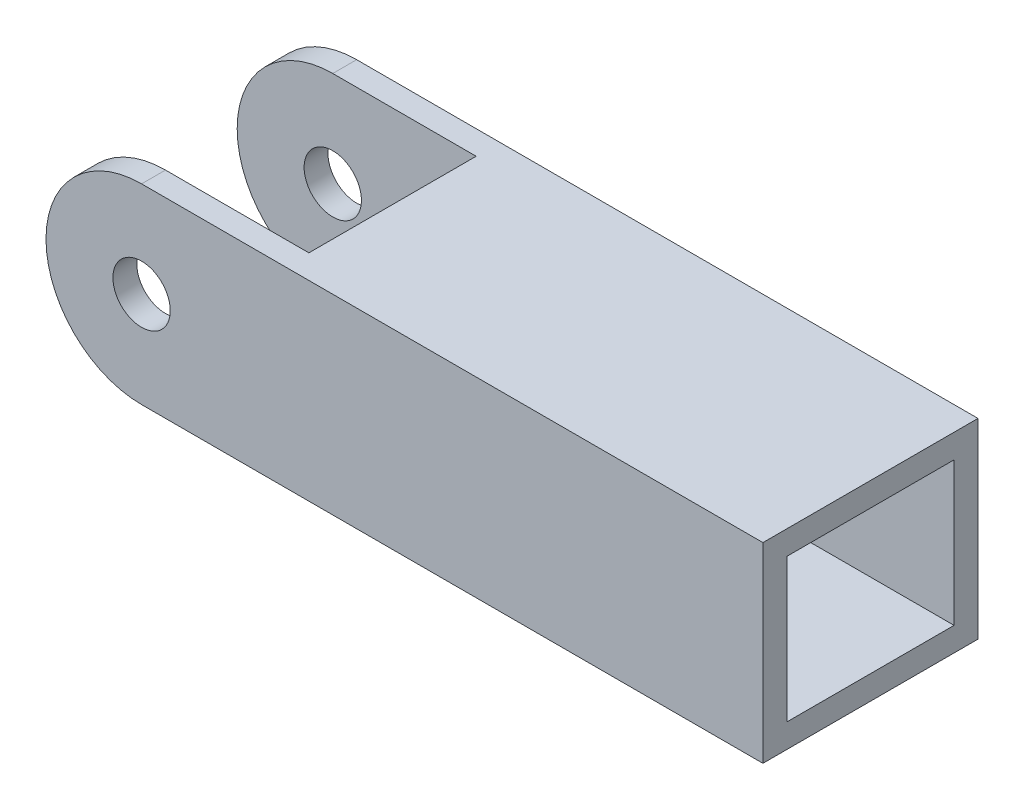
ISO-10303-21;
HEADER;
FILE_DESCRIPTION(('STEP AP214'),'2;1');
FILE_NAME('part.step','',(''),(''),'','','');
FILE_SCHEMA(('AUTOMOTIVE_DESIGN { 1 0 10303 214 1 1 1 1 }'));
ENDSEC;
DATA;
#1=APPLICATION_CONTEXT('core data for automotive mechanical design processes');
#2=APPLICATION_PROTOCOL_DEFINITION('international standard','automotive_design',2000,#1);
#3=PRODUCT_CONTEXT('',#1,'mechanical');
#4=PRODUCT('Part','Part','',(#3));
#5=PRODUCT_RELATED_PRODUCT_CATEGORY('part','',(#4));
#6=PRODUCT_DEFINITION_FORMATION('','',#4);
#7=PRODUCT_DEFINITION_CONTEXT('part definition',#1,'design');
#8=PRODUCT_DEFINITION('design','',#6,#7);
#9=PRODUCT_DEFINITION_SHAPE('','',#8);
#10=(LENGTH_UNIT() NAMED_UNIT(*) SI_UNIT(.MILLI.,.METRE.));
#11=(NAMED_UNIT(*) PLANE_ANGLE_UNIT() SI_UNIT($,.RADIAN.));
#12=(NAMED_UNIT(*) SI_UNIT($,.STERADIAN.) SOLID_ANGLE_UNIT());
#13=UNCERTAINTY_MEASURE_WITH_UNIT(LENGTH_MEASURE(1.E-05),#10,'distance_accuracy_value','');
#14=(GEOMETRIC_REPRESENTATION_CONTEXT(3) GLOBAL_UNCERTAINTY_ASSIGNED_CONTEXT((#13)) GLOBAL_UNIT_ASSIGNED_CONTEXT((#10,
#11,#12)) REPRESENTATION_CONTEXT('',''));
#15=CARTESIAN_POINT('',(0.,0.,0.));
#16=DIRECTION('',(0.,0.,1.));
#17=DIRECTION('',(1.,0.,0.));
#18=AXIS2_PLACEMENT_3D('',#15,#16,#17);
#19=CARTESIAN_POINT('',(-65.,0.,5.));
#20=DIRECTION('',(0.,0.,-1.));
#21=DIRECTION('',(-1.,0.,0.));
#22=AXIS2_PLACEMENT_3D('',#19,#20,#21);
#23=CYLINDRICAL_SURFACE('',#22,20.);
#24=CARTESIAN_POINT('',(-65.,0.,0.));
#25=DIRECTION('',(0.,0.,-1.));
#26=DIRECTION('',(-1.,0.,0.));
#27=AXIS2_PLACEMENT_3D('',#24,#25,#26);
#28=CIRCLE('',#27,20.);
#29=CARTESIAN_POINT('',(-65.,-20.,0.));
#30=VERTEX_POINT('',#29);
#31=CARTESIAN_POINT('',(-65.,20.,0.));
#32=VERTEX_POINT('',#31);
#33=EDGE_CURVE('E205',#30,#32,#28,.T.);
#34=ORIENTED_EDGE('',*,*,#33,.F.);
#35=DIRECTION('',(0.,0.,-1.));
#36=VECTOR('',#35,1.);
#37=CARTESIAN_POINT('',(-65.,-20.,5.));
#38=LINE('',#37,#36);
#39=CARTESIAN_POINT('',(-65.,-20.,5.));
#40=VERTEX_POINT('',#39);
#41=EDGE_CURVE('E11',#40,#30,#38,.T.);
#42=ORIENTED_EDGE('',*,*,#41,.F.);
#43=CARTESIAN_POINT('',(-65.,0.,5.));
#44=DIRECTION('',(0.,0.,-1.));
#45=DIRECTION('',(-1.,0.,0.));
#46=AXIS2_PLACEMENT_3D('',#43,#44,#45);
#47=CIRCLE('',#46,20.);
#48=CARTESIAN_POINT('',(-65.,20.,5.));
#49=VERTEX_POINT('',#48);
#50=EDGE_CURVE('E208',#40,#49,#47,.T.);
#51=ORIENTED_EDGE('',*,*,#50,.T.);
#52=DIRECTION('',(0.,0.,-1.));
#53=VECTOR('',#52,1.);
#54=CARTESIAN_POINT('',(-65.,20.,5.));
#55=LINE('',#54,#53);
#56=EDGE_CURVE('E37',#49,#32,#55,.T.);
#57=ORIENTED_EDGE('',*,*,#56,.T.);
#58=EDGE_LOOP('',(#34,#42,#51,#57));
#59=FACE_BOUND('',#58,.T.);
#60=ADVANCED_FACE('F34',(#59),#23,.T.);
#61=CARTESIAN_POINT('',(-65.,-20.,5.));
#62=DIRECTION('',(0.,1.,0.));
#63=DIRECTION('',(0.,0.,1.));
#64=AXIS2_PLACEMENT_3D('',#61,#62,#63);
#65=PLANE('',#64);
#66=DIRECTION('',(1.,0.,0.));
#67=VECTOR('',#66,1.);
#68=CARTESIAN_POINT('',(-65.,-20.,0.));
#69=LINE('',#68,#67);
#70=CARTESIAN_POINT('',(65.,-20.,0.));
#71=VERTEX_POINT('',#70);
#72=EDGE_CURVE('E212',#30,#71,#69,.T.);
#73=ORIENTED_EDGE('',*,*,#72,.T.);
#74=DIRECTION('',(0.,0.,-1.));
#75=VECTOR('',#74,1.);
#76=CARTESIAN_POINT('',(65.,-20.,5.));
#77=LINE('',#76,#75);
#78=CARTESIAN_POINT('',(65.,-20.,45.));
#79=VERTEX_POINT('',#78);
#80=EDGE_CURVE('E42',#79,#71,#77,.T.);
#81=ORIENTED_EDGE('',*,*,#80,.F.);
#82=DIRECTION('',(1.,0.,0.));
#83=VECTOR('',#82,1.);
#84=CARTESIAN_POINT('',(-65.,-20.,45.));
#85=LINE('',#84,#83);
#86=CARTESIAN_POINT('',(-65.,-20.,45.));
#87=VERTEX_POINT('',#86);
#88=EDGE_CURVE('E167',#87,#79,#85,.T.);
#89=ORIENTED_EDGE('',*,*,#88,.F.);
#90=DIRECTION('',(0.,0.,1.));
#91=VECTOR('',#90,1.);
#92=CARTESIAN_POINT('',(-65.,-20.,40.));
#93=LINE('',#92,#91);
#94=CARTESIAN_POINT('',(-65.,-20.,40.));
#95=VERTEX_POINT('',#94);
#96=EDGE_CURVE('E184',#95,#87,#93,.T.);
#97=ORIENTED_EDGE('',*,*,#96,.F.);
#98=DIRECTION('',(1.,0.,0.));
#99=VECTOR('',#98,1.);
#100=CARTESIAN_POINT('',(-65.,-20.,40.));
#101=LINE('',#100,#99);
#102=CARTESIAN_POINT('',(-35.,-20.,40.));
#103=VERTEX_POINT('',#102);
#104=EDGE_CURVE('E171',#95,#103,#101,.T.);
#105=ORIENTED_EDGE('',*,*,#104,.T.);
#106=DIRECTION('',(0.,0.,-1.));
#107=VECTOR('',#106,1.);
#108=CARTESIAN_POINT('',(-35.,-20.,40.));
#109=LINE('',#108,#107);
#110=CARTESIAN_POINT('',(-35.,-20.,5.));
#111=VERTEX_POINT('',#110);
#112=EDGE_CURVE('E127',#103,#111,#109,.T.);
#113=ORIENTED_EDGE('',*,*,#112,.T.);
#114=DIRECTION('',(1.,0.,0.));
#115=VECTOR('',#114,1.);
#116=CARTESIAN_POINT('',(-65.,-20.,5.));
#117=LINE('',#116,#115);
#118=EDGE_CURVE('E55',#40,#111,#117,.T.);
#119=ORIENTED_EDGE('',*,*,#118,.F.);
#120=ORIENTED_EDGE('',*,*,#41,.T.);
#121=EDGE_LOOP('',(#73,#81,#89,#97,#105,#113,#119,#120));
#122=FACE_BOUND('',#121,.T.);
#123=ADVANCED_FACE('F241',(#122),#65,.F.);
#124=CARTESIAN_POINT('',(65.,-20.,5.));
#125=DIRECTION('',(-1.,0.,0.));
#126=DIRECTION('',(0.,0.,1.));
#127=AXIS2_PLACEMENT_3D('',#124,#125,#126);
#128=PLANE('',#127);
#129=DIRECTION('',(0.,1.,0.));
#130=VECTOR('',#129,1.);
#131=CARTESIAN_POINT('',(65.,-20.,0.));
#132=LINE('',#131,#130);
#133=CARTESIAN_POINT('',(65.,20.,0.));
#134=VERTEX_POINT('',#133);
#135=EDGE_CURVE('E223',#71,#134,#132,.T.);
#136=ORIENTED_EDGE('',*,*,#135,.T.);
#137=DIRECTION('',(0.,0.,-1.));
#138=VECTOR('',#137,1.);
#139=CARTESIAN_POINT('',(65.,20.,5.));
#140=LINE('',#139,#138);
#141=CARTESIAN_POINT('',(65.,20.,45.));
#142=VERTEX_POINT('',#141);
#143=EDGE_CURVE('E227',#142,#134,#140,.T.);
#144=ORIENTED_EDGE('',*,*,#143,.F.);
#145=DIRECTION('',(0.,1.,0.));
#146=VECTOR('',#145,1.);
#147=CARTESIAN_POINT('',(65.,-20.,45.));
#148=LINE('',#147,#146);
#149=EDGE_CURVE('E179',#79,#142,#148,.T.);
#150=ORIENTED_EDGE('',*,*,#149,.F.);
#151=ORIENTED_EDGE('',*,*,#80,.T.);
#152=EDGE_LOOP('',(#136,#144,#150,#151));
#153=FACE_BOUND('',#152,.T.);
#154=DIRECTION('',(0.,1.,0.));
#155=VECTOR('',#154,1.);
#156=CARTESIAN_POINT('',(65.,-20.,5.));
#157=LINE('',#156,#155);
#158=CARTESIAN_POINT('',(65.,-15.,5.));
#159=VERTEX_POINT('',#158);
#160=CARTESIAN_POINT('',(65.,15.,5.));
#161=VERTEX_POINT('',#160);
#162=EDGE_CURVE('E215',#159,#161,#157,.T.);
#163=ORIENTED_EDGE('',*,*,#162,.F.);
#164=DIRECTION('',(0.,0.,-1.));
#165=VECTOR('',#164,1.);
#166=CARTESIAN_POINT('',(65.,-15.,40.));
#167=LINE('',#166,#165);
#168=CARTESIAN_POINT('',(65.,-15.,40.));
#169=VERTEX_POINT('',#168);
#170=EDGE_CURVE('E139',#169,#159,#167,.T.);
#171=ORIENTED_EDGE('',*,*,#170,.F.);
#172=DIRECTION('',(0.,1.,0.));
#173=VECTOR('',#172,1.);
#174=CARTESIAN_POINT('',(65.,-20.,40.));
#175=LINE('',#174,#173);
#176=CARTESIAN_POINT('',(65.,15.,40.));
#177=VERTEX_POINT('',#176);
#178=EDGE_CURVE('E143',#169,#177,#175,.T.);
#179=ORIENTED_EDGE('',*,*,#178,.T.);
#180=DIRECTION('',(0.,0.,-1.));
#181=VECTOR('',#180,1.);
#182=CARTESIAN_POINT('',(65.,15.,40.));
#183=LINE('',#182,#181);
#184=EDGE_CURVE('E190',#177,#161,#183,.T.);
#185=ORIENTED_EDGE('',*,*,#184,.T.);
#186=EDGE_LOOP('',(#163,#171,#179,#185));
#187=FACE_BOUND('',#186,.T.);
#188=ADVANCED_FACE('F244',(#153,#187),#128,.F.);
#189=CARTESIAN_POINT('',(-65.,20.,5.));
#190=DIRECTION('',(0.,1.,0.));
#191=DIRECTION('',(0.,0.,1.));
#192=AXIS2_PLACEMENT_3D('',#189,#190,#191);
#193=PLANE('',#192);
#194=DIRECTION('',(1.,0.,0.));
#195=VECTOR('',#194,1.);
#196=CARTESIAN_POINT('',(-65.,20.,0.));
#197=LINE('',#196,#195);
#198=EDGE_CURVE('E220',#32,#134,#197,.T.);
#199=ORIENTED_EDGE('',*,*,#198,.F.);
#200=ORIENTED_EDGE('',*,*,#56,.F.);
#201=DIRECTION('',(1.,0.,0.));
#202=VECTOR('',#201,1.);
#203=CARTESIAN_POINT('',(-65.,20.,5.));
#204=LINE('',#203,#202);
#205=CARTESIAN_POINT('',(-35.,20.,5.));
#206=VERTEX_POINT('',#205);
#207=EDGE_CURVE('E211',#49,#206,#204,.T.);
#208=ORIENTED_EDGE('',*,*,#207,.T.);
#209=DIRECTION('',(0.,0.,1.));
#210=VECTOR('',#209,1.);
#211=CARTESIAN_POINT('',(-35.,20.,40.));
#212=LINE('',#211,#210);
#213=CARTESIAN_POINT('',(-35.,20.,40.));
#214=VERTEX_POINT('',#213);
#215=EDGE_CURVE('E187',#206,#214,#212,.T.);
#216=ORIENTED_EDGE('',*,*,#215,.T.);
#217=DIRECTION('',(1.,0.,0.));
#218=VECTOR('',#217,1.);
#219=CARTESIAN_POINT('',(-65.,20.,40.));
#220=LINE('',#219,#218);
#221=CARTESIAN_POINT('',(-65.,20.,40.));
#222=VERTEX_POINT('',#221);
#223=EDGE_CURVE('E166',#222,#214,#220,.T.);
#224=ORIENTED_EDGE('',*,*,#223,.F.);
#225=DIRECTION('',(0.,0.,1.));
#226=VECTOR('',#225,1.);
#227=CARTESIAN_POINT('',(-65.,20.,40.));
#228=LINE('',#227,#226);
#229=CARTESIAN_POINT('',(-65.,20.,45.));
#230=VERTEX_POINT('',#229);
#231=EDGE_CURVE('E173',#222,#230,#228,.T.);
#232=ORIENTED_EDGE('',*,*,#231,.T.);
#233=DIRECTION('',(1.,0.,0.));
#234=VECTOR('',#233,1.);
#235=CARTESIAN_POINT('',(-65.,20.,45.));
#236=LINE('',#235,#234);
#237=EDGE_CURVE('E176',#230,#142,#236,.T.);
#238=ORIENTED_EDGE('',*,*,#237,.T.);
#239=ORIENTED_EDGE('',*,*,#143,.T.);
#240=EDGE_LOOP('',(#199,#200,#208,#216,#224,#232,#238,#239));
#241=FACE_BOUND('',#240,.T.);
#242=ADVANCED_FACE('F234',(#241),#193,.T.);
#243=CARTESIAN_POINT('',(-65.,0.,5.));
#244=DIRECTION('',(0.,0.,-1.));
#245=DIRECTION('',(-1.,0.,0.));
#246=AXIS2_PLACEMENT_3D('',#243,#244,#245);
#247=PLANE('',#246);
#248=CARTESIAN_POINT('',(-65.,0.,5.));
#249=DIRECTION('',(0.,0.,-1.));
#250=DIRECTION('',(-1.,0.,0.));
#251=AXIS2_PLACEMENT_3D('',#248,#249,#250);
#252=CIRCLE('',#251,5.99999999999999);
#253=CARTESIAN_POINT('',(-71.,0.,5.));
#254=VERTEX_POINT('',#253);
#255=EDGE_CURVE('E159',#254,#254,#252,.T.);
#256=ORIENTED_EDGE('',*,*,#255,.T.);
#257=EDGE_LOOP('',(#256));
#258=FACE_BOUND('',#257,.T.);
#259=ORIENTED_EDGE('',*,*,#118,.T.);
#260=DIRECTION('',(0.,1.,0.));
#261=VECTOR('',#260,1.);
#262=CARTESIAN_POINT('',(-35.,0.,5.));
#263=LINE('',#262,#261);
#264=CARTESIAN_POINT('',(-35.,-15.,5.));
#265=VERTEX_POINT('',#264);
#266=EDGE_CURVE('E50',#111,#265,#263,.T.);
#267=ORIENTED_EDGE('',*,*,#266,.T.);
#268=DIRECTION('',(1.,0.,0.));
#269=VECTOR('',#268,1.);
#270=CARTESIAN_POINT('',(-65.,-15.,5.));
#271=LINE('',#270,#269);
#272=EDGE_CURVE('E131',#265,#159,#271,.T.);
#273=ORIENTED_EDGE('',*,*,#272,.T.);
#274=ORIENTED_EDGE('',*,*,#162,.T.);
#275=DIRECTION('',(-1.,0.,0.));
#276=VECTOR('',#275,1.);
#277=CARTESIAN_POINT('',(65.,15.,5.));
#278=LINE('',#277,#276);
#279=CARTESIAN_POINT('',(-35.,15.,5.));
#280=VERTEX_POINT('',#279);
#281=EDGE_CURVE('E193',#161,#280,#278,.T.);
#282=ORIENTED_EDGE('',*,*,#281,.T.);
#283=DIRECTION('',(0.,1.,0.));
#284=VECTOR('',#283,1.);
#285=CARTESIAN_POINT('',(-35.,15.,5.));
#286=LINE('',#285,#284);
#287=EDGE_CURVE('E200',#280,#206,#286,.T.);
#288=ORIENTED_EDGE('',*,*,#287,.T.);
#289=ORIENTED_EDGE('',*,*,#207,.F.);
#290=ORIENTED_EDGE('',*,*,#50,.F.);
#291=EDGE_LOOP('',(#259,#267,#273,#274,#282,#288,#289,#290));
#292=FACE_BOUND('',#291,.T.);
#293=ADVANCED_FACE('F255',(#258,#292),#247,.F.);
#294=CARTESIAN_POINT('',(-65.,0.,0.));
#295=DIRECTION('',(0.,0.,-1.));
#296=DIRECTION('',(-1.,0.,0.));
#297=AXIS2_PLACEMENT_3D('',#294,#295,#296);
#298=PLANE('',#297);
#299=ORIENTED_EDGE('',*,*,#135,.F.);
#300=ORIENTED_EDGE('',*,*,#72,.F.);
#301=ORIENTED_EDGE('',*,*,#33,.T.);
#302=ORIENTED_EDGE('',*,*,#198,.T.);
#303=EDGE_LOOP('',(#299,#300,#301,#302));
#304=FACE_BOUND('',#303,.T.);
#305=CARTESIAN_POINT('',(-65.,0.,0.));
#306=DIRECTION('',(0.,0.,-1.));
#307=DIRECTION('',(-1.,0.,0.));
#308=AXIS2_PLACEMENT_3D('',#305,#306,#307);
#309=CIRCLE('',#308,5.99999999999999);
#310=CARTESIAN_POINT('',(-71.,0.,0.));
#311=VERTEX_POINT('',#310);
#312=EDGE_CURVE('E150',#311,#311,#309,.T.);
#313=ORIENTED_EDGE('',*,*,#312,.F.);
#314=EDGE_LOOP('',(#313));
#315=FACE_BOUND('',#314,.T.);
#316=ADVANCED_FACE('F238',(#304,#315),#298,.T.);
#317=CARTESIAN_POINT('',(-35.,15.,40.));
#318=DIRECTION('',(-1.,0.,0.));
#319=DIRECTION('',(0.,0.,1.));
#320=AXIS2_PLACEMENT_3D('',#317,#318,#319);
#321=PLANE('',#320);
#322=ORIENTED_EDGE('',*,*,#215,.F.);
#323=ORIENTED_EDGE('',*,*,#287,.F.);
#324=DIRECTION('',(0.,0.,1.));
#325=VECTOR('',#324,1.);
#326=CARTESIAN_POINT('',(-35.,15.,40.));
#327=LINE('',#326,#325);
#328=CARTESIAN_POINT('',(-35.,15.,40.));
#329=VERTEX_POINT('',#328);
#330=EDGE_CURVE('E196',#280,#329,#327,.T.);
#331=ORIENTED_EDGE('',*,*,#330,.T.);
#332=DIRECTION('',(0.,1.,0.));
#333=VECTOR('',#332,1.);
#334=CARTESIAN_POINT('',(-35.,15.,40.));
#335=LINE('',#334,#333);
#336=EDGE_CURVE('E203',#329,#214,#335,.T.);
#337=ORIENTED_EDGE('',*,*,#336,.T.);
#338=EDGE_LOOP('',(#322,#323,#331,#337));
#339=FACE_BOUND('',#338,.T.);
#340=ADVANCED_FACE('F257',(#339),#321,.T.);
#341=CARTESIAN_POINT('',(0.,15.,0.));
#342=DIRECTION('',(0.,1.,0.));
#343=DIRECTION('',(0.,0.,1.));
#344=AXIS2_PLACEMENT_3D('',#341,#342,#343);
#345=PLANE('',#344);
#346=ORIENTED_EDGE('',*,*,#184,.F.);
#347=DIRECTION('',(1.,0.,0.));
#348=VECTOR('',#347,1.);
#349=CARTESIAN_POINT('',(65.,15.,40.));
#350=LINE('',#349,#348);
#351=EDGE_CURVE('E198',#329,#177,#350,.T.);
#352=ORIENTED_EDGE('',*,*,#351,.F.);
#353=ORIENTED_EDGE('',*,*,#330,.F.);
#354=ORIENTED_EDGE('',*,*,#281,.F.);
#355=EDGE_LOOP('',(#346,#352,#353,#354));
#356=FACE_BOUND('',#355,.T.);
#357=ADVANCED_FACE('F262',(#356),#345,.F.);
#358=CARTESIAN_POINT('',(-65.,0.,40.));
#359=DIRECTION('',(0.,0.,1.));
#360=DIRECTION('',(-1.,0.,0.));
#361=AXIS2_PLACEMENT_3D('',#358,#359,#360);
#362=CYLINDRICAL_SURFACE('',#361,20.);
#363=CARTESIAN_POINT('',(-65.,0.,45.));
#364=DIRECTION('',(0.,0.,-1.));
#365=DIRECTION('',(-1.,0.,0.));
#366=AXIS2_PLACEMENT_3D('',#363,#364,#365);
#367=CIRCLE('',#366,20.);
#368=EDGE_CURVE('E162',#87,#230,#367,.T.);
#369=ORIENTED_EDGE('',*,*,#368,.T.);
#370=ORIENTED_EDGE('',*,*,#231,.F.);
#371=CARTESIAN_POINT('',(-65.,0.,40.));
#372=DIRECTION('',(0.,0.,-1.));
#373=DIRECTION('',(-1.,0.,0.));
#374=AXIS2_PLACEMENT_3D('',#371,#372,#373);
#375=CIRCLE('',#374,20.);
#376=EDGE_CURVE('E163',#95,#222,#375,.T.);
#377=ORIENTED_EDGE('',*,*,#376,.F.);
#378=ORIENTED_EDGE('',*,*,#96,.T.);
#379=EDGE_LOOP('',(#369,#370,#377,#378));
#380=FACE_BOUND('',#379,.T.);
#381=ADVANCED_FACE('F252',(#380),#362,.T.);
#382=CARTESIAN_POINT('',(-65.,0.,40.));
#383=DIRECTION('',(0.,0.,1.));
#384=DIRECTION('',(-1.,0.,0.));
#385=AXIS2_PLACEMENT_3D('',#382,#383,#384);
#386=PLANE('',#385);
#387=CARTESIAN_POINT('',(-65.,0.,40.));
#388=DIRECTION('',(0.,0.,1.));
#389=DIRECTION('',(1.,0.,0.));
#390=AXIS2_PLACEMENT_3D('',#387,#388,#389);
#391=CIRCLE('',#390,5.99999999999999);
#392=CARTESIAN_POINT('',(-71.,0.,40.));
#393=VERTEX_POINT('',#392);
#394=EDGE_CURVE('E154',#393,#393,#391,.T.);
#395=ORIENTED_EDGE('',*,*,#394,.T.);
#396=EDGE_LOOP('',(#395));
#397=FACE_BOUND('',#396,.T.);
#398=DIRECTION('',(-1.,0.,0.));
#399=VECTOR('',#398,1.);
#400=CARTESIAN_POINT('',(65.,-15.,40.));
#401=LINE('',#400,#399);
#402=CARTESIAN_POINT('',(-35.,-15.,40.));
#403=VERTEX_POINT('',#402);
#404=EDGE_CURVE('E132',#169,#403,#401,.T.);
#405=ORIENTED_EDGE('',*,*,#404,.T.);
#406=DIRECTION('',(0.,-1.,0.));
#407=VECTOR('',#406,1.);
#408=CARTESIAN_POINT('',(-35.,-15.,40.));
#409=LINE('',#408,#407);
#410=EDGE_CURVE('E122',#403,#103,#409,.T.);
#411=ORIENTED_EDGE('',*,*,#410,.T.);
#412=ORIENTED_EDGE('',*,*,#104,.F.);
#413=ORIENTED_EDGE('',*,*,#376,.T.);
#414=ORIENTED_EDGE('',*,*,#223,.T.);
#415=ORIENTED_EDGE('',*,*,#336,.F.);
#416=ORIENTED_EDGE('',*,*,#351,.T.);
#417=ORIENTED_EDGE('',*,*,#178,.F.);
#418=EDGE_LOOP('',(#405,#411,#412,#413,#414,#415,#416,#417));
#419=FACE_BOUND('',#418,.T.);
#420=ADVANCED_FACE('F141',(#397,#419),#386,.F.);
#421=CARTESIAN_POINT('',(-65.,0.,45.));
#422=DIRECTION('',(0.,0.,1.));
#423=DIRECTION('',(-1.,0.,0.));
#424=AXIS2_PLACEMENT_3D('',#421,#422,#423);
#425=PLANE('',#424);
#426=CARTESIAN_POINT('',(-65.,0.,45.));
#427=DIRECTION('',(0.,0.,-1.));
#428=DIRECTION('',(-1.,0.,0.));
#429=AXIS2_PLACEMENT_3D('',#426,#427,#428);
#430=CIRCLE('',#429,5.99999999999999);
#431=CARTESIAN_POINT('',(-71.,0.,45.));
#432=VERTEX_POINT('',#431);
#433=EDGE_CURVE('E151',#432,#432,#430,.T.);
#434=ORIENTED_EDGE('',*,*,#433,.T.);
#435=EDGE_LOOP('',(#434));
#436=FACE_BOUND('',#435,.T.);
#437=ORIENTED_EDGE('',*,*,#368,.F.);
#438=ORIENTED_EDGE('',*,*,#88,.T.);
#439=ORIENTED_EDGE('',*,*,#149,.T.);
#440=ORIENTED_EDGE('',*,*,#237,.F.);
#441=EDGE_LOOP('',(#437,#438,#439,#440));
#442=FACE_BOUND('',#441,.T.);
#443=ADVANCED_FACE('F248',(#436,#442),#425,.T.);
#444=CARTESIAN_POINT('',(-65.,0.,45.));
#445=DIRECTION('',(0.,0.,-1.));
#446=DIRECTION('',(-1.,0.,0.));
#447=AXIS2_PLACEMENT_3D('',#444,#445,#446);
#448=CYLINDRICAL_SURFACE('',#447,5.99999999999999);
#449=CARTESIAN_POINT('',(-71.,0.,45.));
#450=CARTESIAN_POINT('',(-71.,0.,44.9479166666667));
#451=CARTESIAN_POINT('',(-71.,0.,44.8958333333333));
#452=CARTESIAN_POINT('',(-71.,0.,44.7916666666667));
#453=CARTESIAN_POINT('',(-71.,0.,44.7395833333333));
#454=CARTESIAN_POINT('',(-71.,0.,44.6354166666667));
#455=CARTESIAN_POINT('',(-71.,0.,44.5833333333333));
#456=CARTESIAN_POINT('',(-71.,0.,44.4791666666667));
#457=CARTESIAN_POINT('',(-71.,0.,44.4270833333333));
#458=CARTESIAN_POINT('',(-71.,0.,44.3229166666667));
#459=CARTESIAN_POINT('',(-71.,0.,44.2708333333333));
#460=CARTESIAN_POINT('',(-71.,0.,44.1666666666667));
#461=CARTESIAN_POINT('',(-71.,0.,44.1145833333333));
#462=CARTESIAN_POINT('',(-71.,0.,44.0104166666667));
#463=CARTESIAN_POINT('',(-71.,0.,43.9583333333333));
#464=CARTESIAN_POINT('',(-71.,0.,43.8541666666667));
#465=CARTESIAN_POINT('',(-71.,0.,43.8020833333333));
#466=CARTESIAN_POINT('',(-71.,0.,43.6979166666667));
#467=CARTESIAN_POINT('',(-71.,0.,43.6458333333333));
#468=CARTESIAN_POINT('',(-71.,0.,43.5416666666667));
#469=CARTESIAN_POINT('',(-71.,0.,43.4895833333333));
#470=CARTESIAN_POINT('',(-71.,0.,43.3854166666667));
#471=CARTESIAN_POINT('',(-71.,0.,43.3333333333333));
#472=CARTESIAN_POINT('',(-71.,0.,43.2291666666667));
#473=CARTESIAN_POINT('',(-71.,0.,43.1770833333333));
#474=CARTESIAN_POINT('',(-71.,0.,43.0729166666667));
#475=CARTESIAN_POINT('',(-71.,0.,43.0208333333333));
#476=CARTESIAN_POINT('',(-71.,0.,42.9166666666667));
#477=CARTESIAN_POINT('',(-71.,0.,42.8645833333333));
#478=CARTESIAN_POINT('',(-71.,0.,42.7604166666667));
#479=CARTESIAN_POINT('',(-71.,0.,42.7083333333333));
#480=CARTESIAN_POINT('',(-71.,0.,42.6041666666667));
#481=CARTESIAN_POINT('',(-71.,0.,42.5520833333333));
#482=CARTESIAN_POINT('',(-71.,0.,42.4479166666667));
#483=CARTESIAN_POINT('',(-71.,0.,42.3958333333333));
#484=CARTESIAN_POINT('',(-71.,0.,42.2916666666667));
#485=CARTESIAN_POINT('',(-71.,0.,42.2395833333333));
#486=CARTESIAN_POINT('',(-71.,0.,42.1354166666667));
#487=CARTESIAN_POINT('',(-71.,0.,42.0833333333333));
#488=CARTESIAN_POINT('',(-71.,0.,41.9791666666667));
#489=CARTESIAN_POINT('',(-71.,0.,41.9270833333333));
#490=CARTESIAN_POINT('',(-71.,0.,41.8229166666667));
#491=CARTESIAN_POINT('',(-71.,0.,41.7708333333333));
#492=CARTESIAN_POINT('',(-71.,0.,41.6666666666667));
#493=CARTESIAN_POINT('',(-71.,0.,41.6145833333333));
#494=CARTESIAN_POINT('',(-71.,0.,41.5104166666667));
#495=CARTESIAN_POINT('',(-71.,0.,41.4583333333333));
#496=CARTESIAN_POINT('',(-71.,0.,41.3541666666667));
#497=CARTESIAN_POINT('',(-71.,0.,41.3020833333333));
#498=CARTESIAN_POINT('',(-71.,0.,41.1979166666667));
#499=CARTESIAN_POINT('',(-71.,0.,41.1458333333333));
#500=CARTESIAN_POINT('',(-71.,0.,41.0416666666667));
#501=CARTESIAN_POINT('',(-71.,0.,40.9895833333333));
#502=CARTESIAN_POINT('',(-71.,0.,40.8854166666667));
#503=CARTESIAN_POINT('',(-71.,0.,40.8333333333333));
#504=CARTESIAN_POINT('',(-71.,0.,40.7291666666667));
#505=CARTESIAN_POINT('',(-71.,0.,40.6770833333333));
#506=CARTESIAN_POINT('',(-71.,0.,40.5729166666667));
#507=CARTESIAN_POINT('',(-71.,0.,40.5208333333333));
#508=CARTESIAN_POINT('',(-71.,0.,40.4166666666667));
#509=CARTESIAN_POINT('',(-71.,0.,40.3645833333333));
#510=CARTESIAN_POINT('',(-71.,0.,40.2604166666667));
#511=CARTESIAN_POINT('',(-71.,0.,40.2083333333333));
#512=CARTESIAN_POINT('',(-71.,0.,40.1041666666667));
#513=CARTESIAN_POINT('',(-71.,0.,40.0520833333333));
#514=CARTESIAN_POINT('',(-71.,0.,40.));
#515=B_SPLINE_CURVE_WITH_KNOTS('',3,(#449,#450,#451,#452,#453,#454,#455,#456,#457,#458,#459,
#460,#461,#462,#463,#464,#465,#466,#467,#468,#469,#470,#471,#472,#473,#474,#475,#476,#477,#478,
#479,#480,#481,#482,#483,#484,#485,#486,#487,#488,#489,#490,#491,#492,#493,#494,#495,#496,#497,
#498,#499,#500,#501,#502,#503,#504,#505,#506,#507,#508,#509,#510,#511,#512,#513,#514),
.UNSPECIFIED.,.F.,.F.,(4,2,2,2,2,2,2,2,2,2,2,2,2,2,2,2,2,2,2,2,2,2,2,2,2,2,2,2,2,2,2,2,4),(0.,
0.156250000000004,0.312500000000007,0.468750000000004,0.625000000000008,0.781250000000004,
0.937500000000008,1.09375,1.25000000000001,1.40625,1.56250000000001,1.71875,1.87500000000001,
2.03125000000001,2.18750000000001,2.34375000000001,2.50000000000001,2.65625000000001,
2.81250000000001,2.96875000000001,3.12500000000001,3.28125000000001,3.43750000000001,
3.59375000000001,3.75000000000001,3.90625000000001,4.06250000000001,4.21875000000001,
4.37500000000001,4.53125000000001,4.68750000000001,4.84375000000001,5.00000000000001),.UNSPECIFIED.);
#516=EDGE_CURVE('BSEAM345',#432,#393,#515,.T.);
#517=ORIENTED_EDGE('',*,*,#433,.F.);
#518=ORIENTED_EDGE('',*,*,#394,.F.);
#519=ORIENTED_EDGE('',*,*,#516,.T.);
#520=ORIENTED_EDGE('',*,*,#516,.F.);
#521=EDGE_LOOP('',(#517,#519,#518,#520));
#522=FACE_BOUND('',#521,.T.);
#523=ADVANCED_FACE('F345',(#522),#448,.F.);
#524=CARTESIAN_POINT('',(-71.,0.,0.));
#525=CARTESIAN_POINT('',(-71.,0.,0.0520833333333322));
#526=CARTESIAN_POINT('',(-71.,0.,0.104166666666664));
#527=CARTESIAN_POINT('',(-71.,0.,0.208333333333331));
#528=CARTESIAN_POINT('',(-71.,0.,0.260416666666666));
#529=CARTESIAN_POINT('',(-71.,0.,0.364583333333335));
#530=CARTESIAN_POINT('',(-71.,0.,0.416666666666669));
#531=CARTESIAN_POINT('',(-71.,0.,0.520833333333336));
#532=CARTESIAN_POINT('',(-71.,0.,0.572916666666668));
#533=CARTESIAN_POINT('',(-71.,0.,0.677083333333333));
#534=CARTESIAN_POINT('',(-71.,0.,0.729166666666665));
#535=CARTESIAN_POINT('',(-71.,0.,0.833333333333332));
#536=CARTESIAN_POINT('',(-71.,0.,0.885416666666666));
#537=CARTESIAN_POINT('',(-71.,0.,0.989583333333335));
#538=CARTESIAN_POINT('',(-71.,0.,1.04166666666667));
#539=CARTESIAN_POINT('',(-71.,0.,1.14583333333334));
#540=CARTESIAN_POINT('',(-71.,0.,1.19791666666667));
#541=CARTESIAN_POINT('',(-71.,0.,1.30208333333333));
#542=CARTESIAN_POINT('',(-71.,0.,1.35416666666667));
#543=CARTESIAN_POINT('',(-71.,0.,1.45833333333333));
#544=CARTESIAN_POINT('',(-71.,0.,1.51041666666667));
#545=CARTESIAN_POINT('',(-71.,0.,1.61458333333334));
#546=CARTESIAN_POINT('',(-71.,0.,1.66666666666667));
#547=CARTESIAN_POINT('',(-71.,0.,1.77083333333334));
#548=CARTESIAN_POINT('',(-71.,0.,1.82291666666667));
#549=CARTESIAN_POINT('',(-71.,0.,1.92708333333333));
#550=CARTESIAN_POINT('',(-71.,0.,1.97916666666667));
#551=CARTESIAN_POINT('',(-71.,0.,2.08333333333333));
#552=CARTESIAN_POINT('',(-71.,0.,2.13541666666667));
#553=CARTESIAN_POINT('',(-71.,0.,2.23958333333334));
#554=CARTESIAN_POINT('',(-71.,0.,2.29166666666667));
#555=CARTESIAN_POINT('',(-71.,0.,2.39583333333334));
#556=CARTESIAN_POINT('',(-71.,0.,2.44791666666667));
#557=CARTESIAN_POINT('',(-71.,0.,2.55208333333333));
#558=CARTESIAN_POINT('',(-71.,0.,2.60416666666667));
#559=CARTESIAN_POINT('',(-71.,0.,2.70833333333333));
#560=CARTESIAN_POINT('',(-71.,0.,2.76041666666667));
#561=CARTESIAN_POINT('',(-71.,0.,2.86458333333334));
#562=CARTESIAN_POINT('',(-71.,0.,2.91666666666667));
#563=CARTESIAN_POINT('',(-71.,0.,3.02083333333334));
#564=CARTESIAN_POINT('',(-71.,0.,3.07291666666667));
#565=CARTESIAN_POINT('',(-71.,0.,3.17708333333334));
#566=CARTESIAN_POINT('',(-71.,0.,3.22916666666667));
#567=CARTESIAN_POINT('',(-71.,0.,3.33333333333333));
#568=CARTESIAN_POINT('',(-71.,0.,3.38541666666667));
#569=CARTESIAN_POINT('',(-71.,0.,3.48958333333334));
#570=CARTESIAN_POINT('',(-71.,0.,3.54166666666667));
#571=CARTESIAN_POINT('',(-71.,0.,3.64583333333334));
#572=CARTESIAN_POINT('',(-71.,0.,3.69791666666667));
#573=CARTESIAN_POINT('',(-71.,0.,3.80208333333334));
#574=CARTESIAN_POINT('',(-71.,0.,3.85416666666667));
#575=CARTESIAN_POINT('',(-71.,0.,3.95833333333333));
#576=CARTESIAN_POINT('',(-71.,0.,4.01041666666667));
#577=CARTESIAN_POINT('',(-71.,0.,4.11458333333334));
#578=CARTESIAN_POINT('',(-71.,0.,4.16666666666667));
#579=CARTESIAN_POINT('',(-71.,0.,4.27083333333334));
#580=CARTESIAN_POINT('',(-71.,0.,4.32291666666667));
#581=CARTESIAN_POINT('',(-71.,0.,4.42708333333334));
#582=CARTESIAN_POINT('',(-71.,0.,4.47916666666667));
#583=CARTESIAN_POINT('',(-71.,0.,4.58333333333333));
#584=CARTESIAN_POINT('',(-71.,0.,4.63541666666667));
#585=CARTESIAN_POINT('',(-71.,0.,4.73958333333334));
#586=CARTESIAN_POINT('',(-71.,0.,4.79166666666667));
#587=CARTESIAN_POINT('',(-71.,0.,4.89583333333334));
#588=CARTESIAN_POINT('',(-71.,0.,4.94791666666667));
#589=CARTESIAN_POINT('',(-71.,0.,5.));
#590=B_SPLINE_CURVE_WITH_KNOTS('',3,(#524,#525,#526,#527,#528,#529,#530,#531,#532,#533,#534,
#535,#536,#537,#538,#539,#540,#541,#542,#543,#544,#545,#546,#547,#548,#549,#550,#551,#552,#553,
#554,#555,#556,#557,#558,#559,#560,#561,#562,#563,#564,#565,#566,#567,#568,#569,#570,#571,#572,
#573,#574,#575,#576,#577,#578,#579,#580,#581,#582,#583,#584,#585,#586,#587,#588,#589),
.UNSPECIFIED.,.F.,.F.,(4,2,2,2,2,2,2,2,2,2,2,2,2,2,2,2,2,2,2,2,2,2,2,2,2,2,2,2,2,2,2,2,4),(0.,
0.156249999999997,0.3125,0.468750000000004,0.625000000000001,0.781249999999997,
0.937500000000001,1.09375,1.25,1.40625,1.5625,1.71875,1.875,2.03125,2.1875,2.34375000000001,2.5,
2.65625,2.8125,2.96875000000001,3.125,3.28125,3.4375,3.59375000000001,3.75,3.90625,4.0625,
4.21875000000001,4.375,4.53125,4.6875,4.84375000000001,5.),.UNSPECIFIED.);
#591=EDGE_CURVE('BSEAM287',#311,#254,#590,.T.);
#592=ORIENTED_EDGE('',*,*,#312,.T.);
#593=ORIENTED_EDGE('',*,*,#255,.F.);
#594=ORIENTED_EDGE('',*,*,#591,.T.);
#595=ORIENTED_EDGE('',*,*,#591,.F.);
#596=EDGE_LOOP('',(#592,#594,#593,#595));
#597=FACE_BOUND('',#596,.T.);
#598=ADVANCED_FACE('F287',(#597),#448,.F.);
#599=CARTESIAN_POINT('',(-35.,-15.,40.));
#600=DIRECTION('',(-1.,0.,0.));
#601=DIRECTION('',(0.,0.,1.));
#602=AXIS2_PLACEMENT_3D('',#599,#600,#601);
#603=PLANE('',#602);
#604=ORIENTED_EDGE('',*,*,#266,.F.);
#605=ORIENTED_EDGE('',*,*,#112,.F.);
#606=ORIENTED_EDGE('',*,*,#410,.F.);
#607=DIRECTION('',(0.,0.,-1.));
#608=VECTOR('',#607,1.);
#609=CARTESIAN_POINT('',(-35.,-15.,40.));
#610=LINE('',#609,#608);
#611=EDGE_CURVE('E125',#403,#265,#610,.T.);
#612=ORIENTED_EDGE('',*,*,#611,.T.);
#613=EDGE_LOOP('',(#604,#605,#606,#612));
#614=FACE_BOUND('',#613,.T.);
#615=ADVANCED_FACE('F124',(#614),#603,.T.);
#616=CARTESIAN_POINT('',(0.,-15.,0.));
#617=DIRECTION('',(0.,1.,0.));
#618=DIRECTION('',(0.,0.,1.));
#619=AXIS2_PLACEMENT_3D('',#616,#617,#618);
#620=PLANE('',#619);
#621=ORIENTED_EDGE('',*,*,#272,.F.);
#622=ORIENTED_EDGE('',*,*,#611,.F.);
#623=ORIENTED_EDGE('',*,*,#404,.F.);
#624=ORIENTED_EDGE('',*,*,#170,.T.);
#625=EDGE_LOOP('',(#621,#622,#623,#624));
#626=FACE_BOUND('',#625,.T.);
#627=ADVANCED_FACE('F136',(#626),#620,.T.);
#628=CLOSED_SHELL('',(#60,#123,#188,#242,#293,#316,#340,#357,#381,#420,#443,#523,#598,#615,#627));
#629=MANIFOLD_SOLID_BREP('B2',#628);
#630=ADVANCED_BREP_SHAPE_REPRESENTATION('',(#18,#629),#14);
#631=SHAPE_DEFINITION_REPRESENTATION(#9,#630);
ENDSEC;
END-ISO-10303-21;
